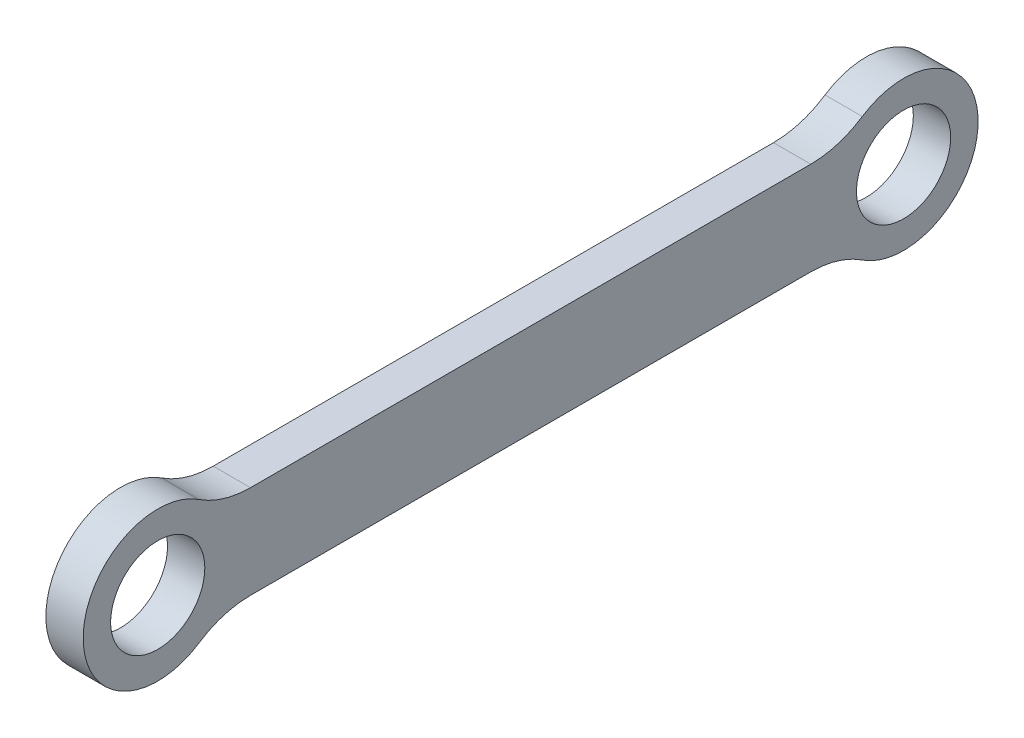
ISO-10303-21;
HEADER;
FILE_DESCRIPTION(('STEP AP214'),'2;1');
FILE_NAME('part.step','',(''),(''),'','','');
FILE_SCHEMA(('AUTOMOTIVE_DESIGN { 1 0 10303 214 1 1 1 1 }'));
ENDSEC;
DATA;
#1=APPLICATION_CONTEXT('core data for automotive mechanical design processes');
#2=APPLICATION_PROTOCOL_DEFINITION('international standard','automotive_design',2000,#1);
#3=PRODUCT_CONTEXT('',#1,'mechanical');
#4=PRODUCT('Part','Part','',(#3));
#5=PRODUCT_RELATED_PRODUCT_CATEGORY('part','',(#4));
#6=PRODUCT_DEFINITION_FORMATION('','',#4);
#7=PRODUCT_DEFINITION_CONTEXT('part definition',#1,'design');
#8=PRODUCT_DEFINITION('design','',#6,#7);
#9=PRODUCT_DEFINITION_SHAPE('','',#8);
#10=(LENGTH_UNIT() NAMED_UNIT(*) SI_UNIT(.MILLI.,.METRE.));
#11=(NAMED_UNIT(*) PLANE_ANGLE_UNIT() SI_UNIT($,.RADIAN.));
#12=(NAMED_UNIT(*) SI_UNIT($,.STERADIAN.) SOLID_ANGLE_UNIT());
#13=UNCERTAINTY_MEASURE_WITH_UNIT(LENGTH_MEASURE(1.E-05),#10,'distance_accuracy_value','');
#14=(GEOMETRIC_REPRESENTATION_CONTEXT(3) GLOBAL_UNCERTAINTY_ASSIGNED_CONTEXT((#13)) GLOBAL_UNIT_ASSIGNED_CONTEXT((#10,
#11,#12)) REPRESENTATION_CONTEXT('',''));
#15=CARTESIAN_POINT('',(0.,0.,0.));
#16=DIRECTION('',(0.,0.,1.));
#17=DIRECTION('',(1.,0.,0.));
#18=AXIS2_PLACEMENT_3D('',#15,#16,#17);
#19=CARTESIAN_POINT('',(4.,0.,-40.));
#20=DIRECTION('',(-1.,0.,0.));
#21=DIRECTION('',(0.,0.,1.));
#22=AXIS2_PLACEMENT_3D('',#19,#20,#21);
#23=CYLINDRICAL_SURFACE('',#22,8.);
#24=CARTESIAN_POINT('',(4.,0.,-40.));
#25=DIRECTION('',(1.,0.,0.));
#26=DIRECTION('',(0.,0.,-1.));
#27=AXIS2_PLACEMENT_3D('',#24,#25,#26);
#28=CIRCLE('',#27,8.);
#29=CARTESIAN_POINT('',(4.,6.66666666666666,-35.5778336128595));
#30=VERTEX_POINT('',#29);
#31=CARTESIAN_POINT('',(4.,-6.66666666666666,-35.5778336128595));
#32=VERTEX_POINT('',#31);
#33=EDGE_CURVE('E169',#30,#32,#28,.F.);
#34=ORIENTED_EDGE('',*,*,#33,.T.);
#35=DIRECTION('',(-1.,0.,0.));
#36=VECTOR('',#35,1.);
#37=CARTESIAN_POINT('',(4.,-6.66666666666666,-35.5778336128595));
#38=LINE('',#37,#36);
#39=CARTESIAN_POINT('',(0.,-6.66666666666666,-35.5778336128595));
#40=VERTEX_POINT('',#39);
#41=EDGE_CURVE('E119',#32,#40,#38,.T.);
#42=ORIENTED_EDGE('',*,*,#41,.T.);
#43=CARTESIAN_POINT('',(0.,0.,-40.));
#44=DIRECTION('',(1.,0.,0.));
#45=DIRECTION('',(0.,0.,-1.));
#46=AXIS2_PLACEMENT_3D('',#43,#44,#45);
#47=CIRCLE('',#46,8.);
#48=CARTESIAN_POINT('',(0.,6.66666666666666,-35.5778336128595));
#49=VERTEX_POINT('',#48);
#50=EDGE_CURVE('E106',#49,#40,#47,.F.);
#51=ORIENTED_EDGE('',*,*,#50,.F.);
#52=DIRECTION('',(-1.,0.,0.));
#53=VECTOR('',#52,1.);
#54=CARTESIAN_POINT('',(4.,6.66666666666666,-35.5778336128595));
#55=LINE('',#54,#53);
#56=EDGE_CURVE('E117',#49,#30,#55,.F.);
#57=ORIENTED_EDGE('',*,*,#56,.T.);
#58=EDGE_LOOP('',(#34,#42,#51,#57));
#59=FACE_BOUND('',#58,.T.);
#60=ADVANCED_FACE('F37',(#59),#23,.T.);
#61=CARTESIAN_POINT('',(4.,4.99999999999999,0.));
#62=DIRECTION('',(0.,-1.,0.));
#63=DIRECTION('',(0.,0.,-1.));
#64=AXIS2_PLACEMENT_3D('',#61,#62,#63);
#65=PLANE('',#64);
#66=DIRECTION('',(0.,0.,1.));
#67=VECTOR('',#66,1.);
#68=CARTESIAN_POINT('',(4.,4.99999999999999,0.));
#69=LINE('',#68,#67);
#70=CARTESIAN_POINT('',(4.,4.99999999999998,-30.0501256289338));
#71=VERTEX_POINT('',#70);
#72=CARTESIAN_POINT('',(4.,4.99999999999999,30.0501256289338));
#73=VERTEX_POINT('',#72);
#74=EDGE_CURVE('E164',#71,#73,#69,.T.);
#75=ORIENTED_EDGE('',*,*,#74,.F.);
#76=DIRECTION('',(-1.,0.,0.));
#77=VECTOR('',#76,1.);
#78=CARTESIAN_POINT('',(4.,4.99999999999998,-30.0501256289338));
#79=LINE('',#78,#77);
#80=CARTESIAN_POINT('',(0.,4.99999999999998,-30.0501256289338));
#81=VERTEX_POINT('',#80);
#82=EDGE_CURVE('E143',#71,#81,#79,.T.);
#83=ORIENTED_EDGE('',*,*,#82,.T.);
#84=DIRECTION('',(0.,0.,1.));
#85=VECTOR('',#84,1.);
#86=CARTESIAN_POINT('',(0.,4.99999999999999,0.));
#87=LINE('',#86,#85);
#88=CARTESIAN_POINT('',(0.,4.99999999999999,30.0501256289338));
#89=VERTEX_POINT('',#88);
#90=EDGE_CURVE('E107',#81,#89,#87,.T.);
#91=ORIENTED_EDGE('',*,*,#90,.T.);
#92=DIRECTION('',(1.,0.,0.));
#93=VECTOR('',#92,1.);
#94=CARTESIAN_POINT('',(4.,4.99999999999999,30.0501256289338));
#95=LINE('',#94,#93);
#96=EDGE_CURVE('E52',#89,#73,#95,.T.);
#97=ORIENTED_EDGE('',*,*,#96,.T.);
#98=EDGE_LOOP('',(#75,#83,#91,#97));
#99=FACE_BOUND('',#98,.T.);
#100=ADVANCED_FACE('F157',(#99),#65,.F.);
#101=CARTESIAN_POINT('',(4.,0.,40.));
#102=DIRECTION('',(-1.,0.,0.));
#103=DIRECTION('',(0.,0.,1.));
#104=AXIS2_PLACEMENT_3D('',#101,#102,#103);
#105=CYLINDRICAL_SURFACE('',#104,8.00000000000001);
#106=CARTESIAN_POINT('',(0.,0.,40.));
#107=DIRECTION('',(1.,0.,0.));
#108=DIRECTION('',(0.,0.,-1.));
#109=AXIS2_PLACEMENT_3D('',#106,#107,#108);
#110=CIRCLE('',#109,8.00000000000001);
#111=CARTESIAN_POINT('',(0.,6.66666666666666,35.5778336128595));
#112=VERTEX_POINT('',#111);
#113=CARTESIAN_POINT('',(0.,-6.66666666666667,35.5778336128595));
#114=VERTEX_POINT('',#113);
#115=EDGE_CURVE('E154',#112,#114,#110,.T.);
#116=ORIENTED_EDGE('',*,*,#115,.T.);
#117=DIRECTION('',(-1.,0.,0.));
#118=VECTOR('',#117,1.);
#119=CARTESIAN_POINT('',(4.,-6.66666666666667,35.5778336128595));
#120=LINE('',#119,#118);
#121=CARTESIAN_POINT('',(4.,-6.66666666666667,35.5778336128595));
#122=VERTEX_POINT('',#121);
#123=EDGE_CURVE('E140',#114,#122,#120,.F.);
#124=ORIENTED_EDGE('',*,*,#123,.T.);
#125=CARTESIAN_POINT('',(4.,0.,40.));
#126=DIRECTION('',(1.,0.,0.));
#127=DIRECTION('',(0.,0.,-1.));
#128=AXIS2_PLACEMENT_3D('',#125,#126,#127);
#129=CIRCLE('',#128,8.00000000000001);
#130=CARTESIAN_POINT('',(4.,6.66666666666666,35.5778336128595));
#131=VERTEX_POINT('',#130);
#132=EDGE_CURVE('E128',#131,#122,#129,.T.);
#133=ORIENTED_EDGE('',*,*,#132,.F.);
#134=DIRECTION('',(-1.,0.,0.));
#135=VECTOR('',#134,1.);
#136=CARTESIAN_POINT('',(4.,6.66666666666666,35.5778336128595));
#137=LINE('',#136,#135);
#138=EDGE_CURVE('E137',#131,#112,#137,.T.);
#139=ORIENTED_EDGE('',*,*,#138,.T.);
#140=EDGE_LOOP('',(#116,#124,#133,#139));
#141=FACE_BOUND('',#140,.T.);
#142=ADVANCED_FACE('F166',(#141),#105,.T.);
#143=CARTESIAN_POINT('',(4.,-4.99999999999999,0.));
#144=DIRECTION('',(0.,-1.,0.));
#145=DIRECTION('',(0.,0.,-1.));
#146=AXIS2_PLACEMENT_3D('',#143,#144,#145);
#147=PLANE('',#146);
#148=DIRECTION('',(0.,0.,1.));
#149=VECTOR('',#148,1.);
#150=CARTESIAN_POINT('',(0.,-4.99999999999999,0.));
#151=LINE('',#150,#149);
#152=CARTESIAN_POINT('',(0.,-4.99999999999998,-30.0501256289338));
#153=VERTEX_POINT('',#152);
#154=CARTESIAN_POINT('',(0.,-4.99999999999999,30.0501256289338));
#155=VERTEX_POINT('',#154);
#156=EDGE_CURVE('E174',#153,#155,#151,.T.);
#157=ORIENTED_EDGE('',*,*,#156,.F.);
#158=DIRECTION('',(1.,0.,0.));
#159=VECTOR('',#158,1.);
#160=CARTESIAN_POINT('',(4.,-4.99999999999998,-30.0501256289338));
#161=LINE('',#160,#159);
#162=CARTESIAN_POINT('',(4.,-4.99999999999998,-30.0501256289338));
#163=VERTEX_POINT('',#162);
#164=EDGE_CURVE('E135',#153,#163,#161,.T.);
#165=ORIENTED_EDGE('',*,*,#164,.T.);
#166=DIRECTION('',(0.,0.,1.));
#167=VECTOR('',#166,1.);
#168=CARTESIAN_POINT('',(4.,-4.99999999999999,0.));
#169=LINE('',#168,#167);
#170=CARTESIAN_POINT('',(4.,-4.99999999999999,30.0501256289338));
#171=VERTEX_POINT('',#170);
#172=EDGE_CURVE('E123',#163,#171,#169,.T.);
#173=ORIENTED_EDGE('',*,*,#172,.T.);
#174=DIRECTION('',(-1.,0.,0.));
#175=VECTOR('',#174,1.);
#176=CARTESIAN_POINT('',(4.,-4.99999999999999,30.0501256289338));
#177=LINE('',#176,#175);
#178=EDGE_CURVE('E125',#171,#155,#177,.T.);
#179=ORIENTED_EDGE('',*,*,#178,.T.);
#180=EDGE_LOOP('',(#157,#165,#173,#179));
#181=FACE_BOUND('',#180,.T.);
#182=ADVANCED_FACE('F195',(#181),#147,.T.);
#183=CARTESIAN_POINT('',(4.,0.,0.));
#184=DIRECTION('',(1.,0.,0.));
#185=DIRECTION('',(0.,0.,-1.));
#186=AXIS2_PLACEMENT_3D('',#183,#184,#185);
#187=PLANE('',#186);
#188=CARTESIAN_POINT('',(4.,0.,40.));
#189=DIRECTION('',(1.,0.,0.));
#190=DIRECTION('',(0.,0.,-1.));
#191=AXIS2_PLACEMENT_3D('',#188,#189,#190);
#192=CIRCLE('',#191,5.05);
#193=CARTESIAN_POINT('',(4.,0.,34.95));
#194=VERTEX_POINT('',#193);
#195=EDGE_CURVE('E178',#194,#194,#192,.T.);
#196=ORIENTED_EDGE('',*,*,#195,.F.);
#197=EDGE_LOOP('',(#196));
#198=FACE_BOUND('',#197,.T.);
#199=CARTESIAN_POINT('',(4.,0.,-40.));
#200=DIRECTION('',(1.,0.,0.));
#201=DIRECTION('',(0.,0.,-1.));
#202=AXIS2_PLACEMENT_3D('',#199,#200,#201);
#203=CIRCLE('',#202,5.05);
#204=CARTESIAN_POINT('',(4.,0.,-45.05));
#205=VERTEX_POINT('',#204);
#206=EDGE_CURVE('E183',#205,#205,#203,.T.);
#207=ORIENTED_EDGE('',*,*,#206,.F.);
#208=EDGE_LOOP('',(#207));
#209=FACE_BOUND('',#208,.T.);
#210=ORIENTED_EDGE('',*,*,#33,.F.);
#211=CARTESIAN_POINT('',(4.,15.,-30.0501256289338));
#212=DIRECTION('',(1.,0.,0.));
#213=DIRECTION('',(0.,0.,-1.));
#214=AXIS2_PLACEMENT_3D('',#211,#212,#213);
#215=CIRCLE('',#214,10.);
#216=EDGE_CURVE('E59',#30,#71,#215,.F.);
#217=ORIENTED_EDGE('',*,*,#216,.T.);
#218=ORIENTED_EDGE('',*,*,#74,.T.);
#219=CARTESIAN_POINT('',(4.,15.,30.0501256289338));
#220=DIRECTION('',(1.,0.,0.));
#221=DIRECTION('',(0.,0.,-1.));
#222=AXIS2_PLACEMENT_3D('',#219,#220,#221);
#223=CIRCLE('',#222,10.);
#224=EDGE_CURVE('E11',#73,#131,#223,.F.);
#225=ORIENTED_EDGE('',*,*,#224,.T.);
#226=ORIENTED_EDGE('',*,*,#132,.T.);
#227=CARTESIAN_POINT('',(4.,-15.,30.0501256289338));
#228=DIRECTION('',(1.,0.,0.));
#229=DIRECTION('',(0.,0.,-1.));
#230=AXIS2_PLACEMENT_3D('',#227,#228,#229);
#231=CIRCLE('',#230,10.);
#232=EDGE_CURVE('E112',#122,#171,#231,.F.);
#233=ORIENTED_EDGE('',*,*,#232,.T.);
#234=ORIENTED_EDGE('',*,*,#172,.F.);
#235=CARTESIAN_POINT('',(4.,-15.,-30.0501256289338));
#236=DIRECTION('',(1.,0.,0.));
#237=DIRECTION('',(0.,0.,-1.));
#238=AXIS2_PLACEMENT_3D('',#235,#236,#237);
#239=CIRCLE('',#238,10.);
#240=EDGE_CURVE('E147',#163,#32,#239,.F.);
#241=ORIENTED_EDGE('',*,*,#240,.T.);
#242=EDGE_LOOP('',(#210,#217,#218,#225,#226,#233,#234,#241));
#243=FACE_BOUND('',#242,.T.);
#244=ADVANCED_FACE('F162',(#198,#209,#243),#187,.T.);
#245=CARTESIAN_POINT('',(0.,0.,0.));
#246=DIRECTION('',(1.,0.,0.));
#247=DIRECTION('',(0.,0.,-1.));
#248=AXIS2_PLACEMENT_3D('',#245,#246,#247);
#249=PLANE('',#248);
#250=CARTESIAN_POINT('',(0.,0.,40.));
#251=DIRECTION('',(1.,0.,0.));
#252=DIRECTION('',(0.,0.,-1.));
#253=AXIS2_PLACEMENT_3D('',#250,#251,#252);
#254=CIRCLE('',#253,5.05);
#255=CARTESIAN_POINT('',(0.,0.,34.95));
#256=VERTEX_POINT('',#255);
#257=EDGE_CURVE('E120',#256,#256,#254,.T.);
#258=ORIENTED_EDGE('',*,*,#257,.T.);
#259=EDGE_LOOP('',(#258));
#260=FACE_BOUND('',#259,.T.);
#261=CARTESIAN_POINT('',(0.,0.,-40.));
#262=DIRECTION('',(1.,0.,0.));
#263=DIRECTION('',(0.,0.,-1.));
#264=AXIS2_PLACEMENT_3D('',#261,#262,#263);
#265=CIRCLE('',#264,5.05);
#266=CARTESIAN_POINT('',(0.,0.,-45.05));
#267=VERTEX_POINT('',#266);
#268=EDGE_CURVE('E176',#267,#267,#265,.T.);
#269=ORIENTED_EDGE('',*,*,#268,.T.);
#270=EDGE_LOOP('',(#269));
#271=FACE_BOUND('',#270,.T.);
#272=ORIENTED_EDGE('',*,*,#90,.F.);
#273=CARTESIAN_POINT('',(0.,15.,-30.0501256289338));
#274=DIRECTION('',(1.,0.,0.));
#275=DIRECTION('',(0.,0.,-1.));
#276=AXIS2_PLACEMENT_3D('',#273,#274,#275);
#277=CIRCLE('',#276,10.);
#278=EDGE_CURVE('E103',#81,#49,#277,.T.);
#279=ORIENTED_EDGE('',*,*,#278,.T.);
#280=ORIENTED_EDGE('',*,*,#50,.T.);
#281=CARTESIAN_POINT('',(0.,-15.,-30.0501256289338));
#282=DIRECTION('',(1.,0.,0.));
#283=DIRECTION('',(0.,0.,-1.));
#284=AXIS2_PLACEMENT_3D('',#281,#282,#283);
#285=CIRCLE('',#284,10.);
#286=EDGE_CURVE('E145',#40,#153,#285,.T.);
#287=ORIENTED_EDGE('',*,*,#286,.T.);
#288=ORIENTED_EDGE('',*,*,#156,.T.);
#289=CARTESIAN_POINT('',(0.,-15.,30.0501256289338));
#290=DIRECTION('',(1.,0.,0.));
#291=DIRECTION('',(0.,0.,-1.));
#292=AXIS2_PLACEMENT_3D('',#289,#290,#291);
#293=CIRCLE('',#292,10.);
#294=EDGE_CURVE('E149',#155,#114,#293,.T.);
#295=ORIENTED_EDGE('',*,*,#294,.T.);
#296=ORIENTED_EDGE('',*,*,#115,.F.);
#297=CARTESIAN_POINT('',(0.,15.,30.0501256289338));
#298=DIRECTION('',(1.,0.,0.));
#299=DIRECTION('',(0.,0.,-1.));
#300=AXIS2_PLACEMENT_3D('',#297,#298,#299);
#301=CIRCLE('',#300,10.);
#302=EDGE_CURVE('E45',#112,#89,#301,.T.);
#303=ORIENTED_EDGE('',*,*,#302,.T.);
#304=EDGE_LOOP('',(#272,#279,#280,#287,#288,#295,#296,#303));
#305=FACE_BOUND('',#304,.T.);
#306=ADVANCED_FACE('F105',(#260,#271,#305),#249,.F.);
#307=CARTESIAN_POINT('',(-6.,0.,-40.));
#308=DIRECTION('',(1.,0.,0.));
#309=DIRECTION('',(0.,0.,-1.));
#310=AXIS2_PLACEMENT_3D('',#307,#308,#309);
#311=CYLINDRICAL_SURFACE('',#310,5.05);
#312=ORIENTED_EDGE('',*,*,#206,.T.);
#313=EDGE_LOOP('',(#312));
#314=FACE_BOUND('',#313,.T.);
#315=ORIENTED_EDGE('',*,*,#268,.F.);
#316=EDGE_LOOP('',(#315));
#317=FACE_BOUND('',#316,.T.);
#318=ADVANCED_FACE('F221',(#314,#317),#311,.F.);
#319=CARTESIAN_POINT('',(-6.,0.,40.));
#320=DIRECTION('',(1.,0.,0.));
#321=DIRECTION('',(0.,0.,-1.));
#322=AXIS2_PLACEMENT_3D('',#319,#320,#321);
#323=CYLINDRICAL_SURFACE('',#322,5.05);
#324=ORIENTED_EDGE('',*,*,#195,.T.);
#325=EDGE_LOOP('',(#324));
#326=FACE_BOUND('',#325,.T.);
#327=ORIENTED_EDGE('',*,*,#257,.F.);
#328=EDGE_LOOP('',(#327));
#329=FACE_BOUND('',#328,.T.);
#330=ADVANCED_FACE('F206',(#326,#329),#323,.F.);
#331=CARTESIAN_POINT('',(4.,-15.,-30.0501256289338));
#332=DIRECTION('',(-1.,0.,0.));
#333=DIRECTION('',(0.,0.,1.));
#334=AXIS2_PLACEMENT_3D('',#331,#332,#333);
#335=CYLINDRICAL_SURFACE('',#334,10.);
#336=ORIENTED_EDGE('',*,*,#240,.F.);
#337=ORIENTED_EDGE('',*,*,#164,.F.);
#338=ORIENTED_EDGE('',*,*,#286,.F.);
#339=ORIENTED_EDGE('',*,*,#41,.F.);
#340=EDGE_LOOP('',(#336,#337,#338,#339));
#341=FACE_BOUND('',#340,.T.);
#342=ADVANCED_FACE('F191',(#341),#335,.F.);
#343=CARTESIAN_POINT('',(4.,-15.,30.0501256289338));
#344=DIRECTION('',(-1.,0.,0.));
#345=DIRECTION('',(0.,0.,1.));
#346=AXIS2_PLACEMENT_3D('',#343,#344,#345);
#347=CYLINDRICAL_SURFACE('',#346,10.);
#348=ORIENTED_EDGE('',*,*,#232,.F.);
#349=ORIENTED_EDGE('',*,*,#123,.F.);
#350=ORIENTED_EDGE('',*,*,#294,.F.);
#351=ORIENTED_EDGE('',*,*,#178,.F.);
#352=EDGE_LOOP('',(#348,#349,#350,#351));
#353=FACE_BOUND('',#352,.T.);
#354=ADVANCED_FACE('F199',(#353),#347,.F.);
#355=CARTESIAN_POINT('',(4.,15.,-30.0501256289338));
#356=DIRECTION('',(-1.,0.,0.));
#357=DIRECTION('',(0.,0.,1.));
#358=AXIS2_PLACEMENT_3D('',#355,#356,#357);
#359=CYLINDRICAL_SURFACE('',#358,10.);
#360=ORIENTED_EDGE('',*,*,#216,.F.);
#361=ORIENTED_EDGE('',*,*,#56,.F.);
#362=ORIENTED_EDGE('',*,*,#278,.F.);
#363=ORIENTED_EDGE('',*,*,#82,.F.);
#364=EDGE_LOOP('',(#360,#361,#362,#363));
#365=FACE_BOUND('',#364,.T.);
#366=ADVANCED_FACE('F122',(#365),#359,.F.);
#367=CARTESIAN_POINT('',(4.,15.,30.0501256289338));
#368=DIRECTION('',(-1.,0.,0.));
#369=DIRECTION('',(0.,0.,1.));
#370=AXIS2_PLACEMENT_3D('',#367,#368,#369);
#371=CYLINDRICAL_SURFACE('',#370,10.);
#372=ORIENTED_EDGE('',*,*,#224,.F.);
#373=ORIENTED_EDGE('',*,*,#96,.F.);
#374=ORIENTED_EDGE('',*,*,#302,.F.);
#375=ORIENTED_EDGE('',*,*,#138,.F.);
#376=EDGE_LOOP('',(#372,#373,#374,#375));
#377=FACE_BOUND('',#376,.T.);
#378=ADVANCED_FACE('F39',(#377),#371,.F.);
#379=CLOSED_SHELL('',(#60,#100,#142,#182,#244,#306,#318,#330,#342,#354,#366,#378));
#380=MANIFOLD_SOLID_BREP('B2',#379);
#381=ADVANCED_BREP_SHAPE_REPRESENTATION('',(#18,#380),#14);
#382=SHAPE_DEFINITION_REPRESENTATION(#9,#381);
ENDSEC;
END-ISO-10303-21;
